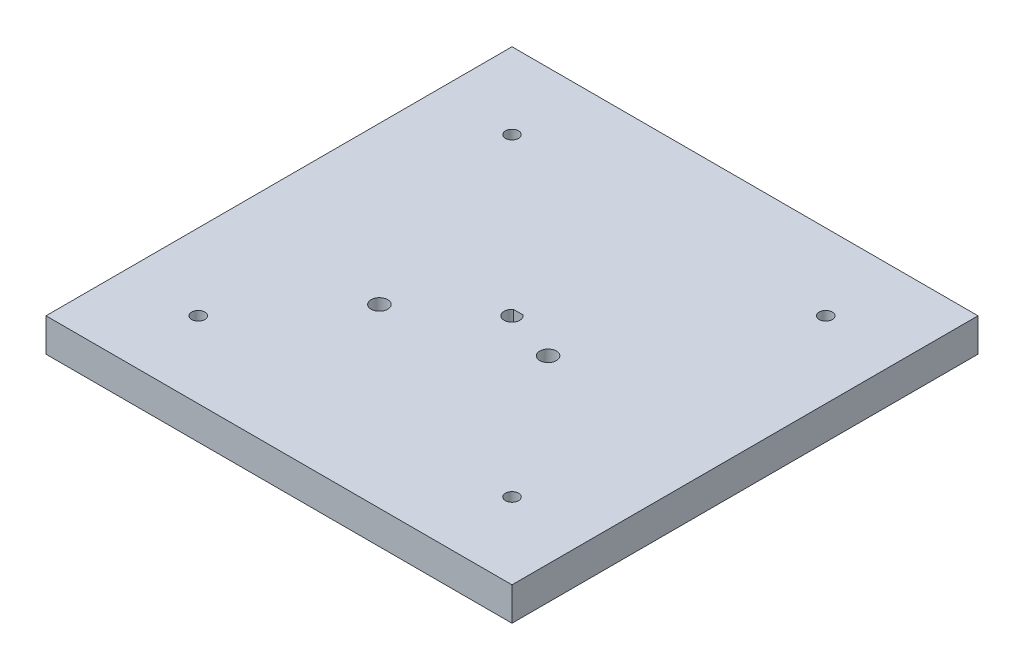
ISO-10303-21;
HEADER;
FILE_DESCRIPTION(('STEP AP214'),'2;1');
FILE_NAME('part.step','',(''),(''),'','','');
FILE_SCHEMA(('AUTOMOTIVE_DESIGN { 1 0 10303 214 1 1 1 1 }'));
ENDSEC;
DATA;
#1=APPLICATION_CONTEXT('core data for automotive mechanical design processes');
#2=APPLICATION_PROTOCOL_DEFINITION('international standard','automotive_design',2000,#1);
#3=PRODUCT_CONTEXT('',#1,'mechanical');
#4=PRODUCT('Part','Part','',(#3));
#5=PRODUCT_RELATED_PRODUCT_CATEGORY('part','',(#4));
#6=PRODUCT_DEFINITION_FORMATION('','',#4);
#7=PRODUCT_DEFINITION_CONTEXT('part definition',#1,'design');
#8=PRODUCT_DEFINITION('design','',#6,#7);
#9=PRODUCT_DEFINITION_SHAPE('','',#8);
#10=(LENGTH_UNIT() NAMED_UNIT(*) SI_UNIT(.MILLI.,.METRE.));
#11=(NAMED_UNIT(*) PLANE_ANGLE_UNIT() SI_UNIT($,.RADIAN.));
#12=(NAMED_UNIT(*) SI_UNIT($,.STERADIAN.) SOLID_ANGLE_UNIT());
#13=UNCERTAINTY_MEASURE_WITH_UNIT(LENGTH_MEASURE(1.E-05),#10,'distance_accuracy_value','');
#14=(GEOMETRIC_REPRESENTATION_CONTEXT(3) GLOBAL_UNCERTAINTY_ASSIGNED_CONTEXT((#13)) GLOBAL_UNIT_ASSIGNED_CONTEXT((#10,
#11,#12)) REPRESENTATION_CONTEXT('',''));
#15=CARTESIAN_POINT('',(0.,0.,0.));
#16=DIRECTION('',(0.,0.,1.));
#17=DIRECTION('',(1.,0.,0.));
#18=AXIS2_PLACEMENT_3D('',#15,#16,#17);
#19=CARTESIAN_POINT('',(0.,6.35,0.));
#20=DIRECTION('',(0.,-1.,0.));
#21=DIRECTION('',(0.,0.,-1.));
#22=AXIS2_PLACEMENT_3D('',#19,#20,#21);
#23=PLANE('',#22);
#24=CARTESIAN_POINT('',(20.1133422082485,6.35,6.34999999999994));
#25=DIRECTION('',(0.,1.,0.));
#26=DIRECTION('',(0.,0.,1.));
#27=AXIS2_PLACEMENT_3D('',#24,#25,#26);
#28=CIRCLE('',#27,3.17499999999999);
#29=CARTESIAN_POINT('',(20.1133422082485,6.35,9.52499999999993));
#30=VERTEX_POINT('',#29);
#31=EDGE_CURVE('E211',#30,#30,#28,.T.);
#32=ORIENTED_EDGE('',*,*,#31,.F.);
#33=EDGE_LOOP('',(#32));
#34=FACE_BOUND('',#33,.T.);
#35=CARTESIAN_POINT('',(-29.0356577917515,6.35,21.552614690566));
#36=DIRECTION('',(0.,1.,0.));
#37=DIRECTION('',(0.,0.,1.));
#38=AXIS2_PLACEMENT_3D('',#35,#36,#37);
#39=CIRCLE('',#38,3.175);
#40=CARTESIAN_POINT('',(-29.0356577917515,6.35,24.727614690566));
#41=VERTEX_POINT('',#40);
#42=EDGE_CURVE('E217',#41,#41,#39,.T.);
#43=ORIENTED_EDGE('',*,*,#42,.F.);
#44=EDGE_LOOP('',(#43));
#45=FACE_BOUND('',#44,.T.);
#46=CARTESIAN_POINT('',(-59.8565890274412,6.35,59.8565890274411));
#47=DIRECTION('',(0.,-1.,0.));
#48=DIRECTION('',(0.,0.,-1.));
#49=AXIS2_PLACEMENT_3D('',#46,#47,#48);
#50=CIRCLE('',#49,2.5);
#51=CARTESIAN_POINT('',(-59.8565890274412,6.35,57.3565890274412));
#52=VERTEX_POINT('',#51);
#53=EDGE_CURVE('E215',#52,#52,#50,.F.);
#54=ORIENTED_EDGE('',*,*,#53,.F.);
#55=EDGE_LOOP('',(#54));
#56=FACE_BOUND('',#55,.T.);
#57=CARTESIAN_POINT('',(59.856589027441,6.35,59.8565890274416));
#58=DIRECTION('',(0.,-1.,0.));
#59=DIRECTION('',(0.,0.,-1.));
#60=AXIS2_PLACEMENT_3D('',#57,#58,#59);
#61=CIRCLE('',#60,2.5);
#62=CARTESIAN_POINT('',(59.856589027441,6.35,57.3565890274416));
#63=VERTEX_POINT('',#62);
#64=EDGE_CURVE('E229',#63,#63,#61,.F.);
#65=ORIENTED_EDGE('',*,*,#64,.F.);
#66=EDGE_LOOP('',(#65));
#67=FACE_BOUND('',#66,.T.);
#68=CARTESIAN_POINT('',(59.8565890274413,6.35,-59.8565890274412));
#69=DIRECTION('',(0.,-1.,0.));
#70=DIRECTION('',(0.,0.,-1.));
#71=AXIS2_PLACEMENT_3D('',#68,#69,#70);
#72=CIRCLE('',#71,2.5);
#73=CARTESIAN_POINT('',(59.8565890274413,6.35,-62.3565890274412));
#74=VERTEX_POINT('',#73);
#75=EDGE_CURVE('E228',#74,#74,#72,.F.);
#76=ORIENTED_EDGE('',*,*,#75,.F.);
#77=EDGE_LOOP('',(#76));
#78=FACE_BOUND('',#77,.T.);
#79=CARTESIAN_POINT('',(-59.856589027441,6.35,-59.8565890274417));
#80=DIRECTION('',(0.,-1.,0.));
#81=DIRECTION('',(0.,0.,-1.));
#82=AXIS2_PLACEMENT_3D('',#79,#80,#81);
#83=CIRCLE('',#82,2.5);
#84=CARTESIAN_POINT('',(-59.856589027441,6.35,-62.3565890274417));
#85=VERTEX_POINT('',#84);
#86=EDGE_CURVE('E101',#85,#85,#83,.F.);
#87=ORIENTED_EDGE('',*,*,#86,.F.);
#88=EDGE_LOOP('',(#87));
#89=FACE_BOUND('',#88,.T.);
#90=DIRECTION('',(0.,0.,-1.));
#91=VECTOR('',#90,1.);
#92=CARTESIAN_POINT('',(88.9,6.35,88.9));
#93=LINE('',#92,#91);
#94=CARTESIAN_POINT('',(88.9,6.35,88.9));
#95=VERTEX_POINT('',#94);
#96=CARTESIAN_POINT('',(88.9,6.35,-88.9));
#97=VERTEX_POINT('',#96);
#98=EDGE_CURVE('E107',#95,#97,#93,.T.);
#99=ORIENTED_EDGE('',*,*,#98,.T.);
#100=DIRECTION('',(-1.,0.,0.));
#101=VECTOR('',#100,1.);
#102=CARTESIAN_POINT('',(-88.9,6.35,-88.9));
#103=LINE('',#102,#101);
#104=CARTESIAN_POINT('',(-88.9,6.35,-88.9));
#105=VERTEX_POINT('',#104);
#106=EDGE_CURVE('E110',#97,#105,#103,.T.);
#107=ORIENTED_EDGE('',*,*,#106,.T.);
#108=DIRECTION('',(0.,0.,1.));
#109=VECTOR('',#108,1.);
#110=CARTESIAN_POINT('',(-88.9,6.35,88.9));
#111=LINE('',#110,#109);
#112=CARTESIAN_POINT('',(-88.9,6.35,88.9));
#113=VERTEX_POINT('',#112);
#114=EDGE_CURVE('E113',#105,#113,#111,.T.);
#115=ORIENTED_EDGE('',*,*,#114,.T.);
#116=DIRECTION('',(1.,0.,0.));
#117=VECTOR('',#116,1.);
#118=CARTESIAN_POINT('',(-88.9,6.35,88.9));
#119=LINE('',#118,#117);
#120=EDGE_CURVE('E115',#113,#95,#119,.T.);
#121=ORIENTED_EDGE('',*,*,#120,.T.);
#122=EDGE_LOOP('',(#99,#107,#115,#121));
#123=FACE_BOUND('',#122,.T.);
#124=CARTESIAN_POINT('',(0.,6.35,0.));
#125=DIRECTION('',(0.,1.,0.));
#126=DIRECTION('',(0.,0.,1.));
#127=AXIS2_PLACEMENT_3D('',#124,#125,#126);
#128=CIRCLE('',#127,2.99999999999999);
#129=CARTESIAN_POINT('',(-1.79999999999999,6.35,-2.4));
#130=VERTEX_POINT('',#129);
#131=CARTESIAN_POINT('',(1.80000000000001,6.35,-2.4));
#132=VERTEX_POINT('',#131);
#133=EDGE_CURVE('E93',#130,#132,#128,.T.);
#134=ORIENTED_EDGE('',*,*,#133,.F.);
#135=DIRECTION('',(-1.,0.,0.));
#136=VECTOR('',#135,1.);
#137=CARTESIAN_POINT('',(-1.79999999999999,6.35,-2.4));
#138=LINE('',#137,#136);
#139=EDGE_CURVE('E87',#132,#130,#138,.T.);
#140=ORIENTED_EDGE('',*,*,#139,.F.);
#141=EDGE_LOOP('',(#134,#140));
#142=FACE_BOUND('',#141,.T.);
#143=ADVANCED_FACE('F35',(#34,#45,#56,#67,#78,#89,#123,#142),#23,.F.);
#144=CARTESIAN_POINT('',(0.,-6.35,0.));
#145=DIRECTION('',(0.,-1.,0.));
#146=DIRECTION('',(0.,0.,-1.));
#147=AXIS2_PLACEMENT_3D('',#144,#145,#146);
#148=PLANE('',#147);
#149=CARTESIAN_POINT('',(20.1133422082485,-6.35,6.34999999999994));
#150=DIRECTION('',(0.,-1.,0.));
#151=DIRECTION('',(0.,0.,-1.));
#152=AXIS2_PLACEMENT_3D('',#149,#150,#151);
#153=CIRCLE('',#152,3.17499999999999);
#154=CARTESIAN_POINT('',(20.1133422082485,-6.35,3.17499999999995));
#155=VERTEX_POINT('',#154);
#156=EDGE_CURVE('E209',#155,#155,#153,.F.);
#157=ORIENTED_EDGE('',*,*,#156,.T.);
#158=EDGE_LOOP('',(#157));
#159=FACE_BOUND('',#158,.T.);
#160=CARTESIAN_POINT('',(-29.0356577917515,-6.35,21.552614690566));
#161=DIRECTION('',(0.,-1.,0.));
#162=DIRECTION('',(0.,0.,-1.));
#163=AXIS2_PLACEMENT_3D('',#160,#161,#162);
#164=CIRCLE('',#163,3.175);
#165=CARTESIAN_POINT('',(-29.0356577917515,-6.35,18.377614690566));
#166=VERTEX_POINT('',#165);
#167=EDGE_CURVE('E222',#166,#166,#164,.F.);
#168=ORIENTED_EDGE('',*,*,#167,.T.);
#169=EDGE_LOOP('',(#168));
#170=FACE_BOUND('',#169,.T.);
#171=CARTESIAN_POINT('',(-59.8565890274412,-6.35,59.8565890274411));
#172=DIRECTION('',(0.,-1.,0.));
#173=DIRECTION('',(0.,0.,-1.));
#174=AXIS2_PLACEMENT_3D('',#171,#172,#173);
#175=CIRCLE('',#174,2.5);
#176=CARTESIAN_POINT('',(-59.8565890274412,-6.35,57.3565890274412));
#177=VERTEX_POINT('',#176);
#178=EDGE_CURVE('E212',#177,#177,#175,.T.);
#179=ORIENTED_EDGE('',*,*,#178,.F.);
#180=EDGE_LOOP('',(#179));
#181=FACE_BOUND('',#180,.T.);
#182=CARTESIAN_POINT('',(59.856589027441,-6.35,59.8565890274416));
#183=DIRECTION('',(0.,-1.,0.));
#184=DIRECTION('',(0.,0.,-1.));
#185=AXIS2_PLACEMENT_3D('',#182,#183,#184);
#186=CIRCLE('',#185,2.5);
#187=CARTESIAN_POINT('',(59.856589027441,-6.35,57.3565890274416));
#188=VERTEX_POINT('',#187);
#189=EDGE_CURVE('E233',#188,#188,#186,.T.);
#190=ORIENTED_EDGE('',*,*,#189,.F.);
#191=EDGE_LOOP('',(#190));
#192=FACE_BOUND('',#191,.T.);
#193=CARTESIAN_POINT('',(59.8565890274413,-6.35,-59.8565890274412));
#194=DIRECTION('',(0.,-1.,0.));
#195=DIRECTION('',(0.,0.,-1.));
#196=AXIS2_PLACEMENT_3D('',#193,#194,#195);
#197=CIRCLE('',#196,2.5);
#198=CARTESIAN_POINT('',(59.8565890274413,-6.35,-62.3565890274412));
#199=VERTEX_POINT('',#198);
#200=EDGE_CURVE('E225',#199,#199,#197,.T.);
#201=ORIENTED_EDGE('',*,*,#200,.F.);
#202=EDGE_LOOP('',(#201));
#203=FACE_BOUND('',#202,.T.);
#204=CARTESIAN_POINT('',(-59.856589027441,-6.35,-59.8565890274417));
#205=DIRECTION('',(0.,-1.,0.));
#206=DIRECTION('',(0.,0.,-1.));
#207=AXIS2_PLACEMENT_3D('',#204,#205,#206);
#208=CIRCLE('',#207,2.5);
#209=CARTESIAN_POINT('',(-59.856589027441,-6.35,-62.3565890274417));
#210=VERTEX_POINT('',#209);
#211=EDGE_CURVE('E232',#210,#210,#208,.T.);
#212=ORIENTED_EDGE('',*,*,#211,.F.);
#213=EDGE_LOOP('',(#212));
#214=FACE_BOUND('',#213,.T.);
#215=DIRECTION('',(0.,0.,-1.));
#216=VECTOR('',#215,1.);
#217=CARTESIAN_POINT('',(88.9,-6.35,88.9));
#218=LINE('',#217,#216);
#219=CARTESIAN_POINT('',(88.9,-6.35,88.9));
#220=VERTEX_POINT('',#219);
#221=CARTESIAN_POINT('',(88.9,-6.35,-88.9));
#222=VERTEX_POINT('',#221);
#223=EDGE_CURVE('E106',#220,#222,#218,.T.);
#224=ORIENTED_EDGE('',*,*,#223,.F.);
#225=DIRECTION('',(1.,0.,0.));
#226=VECTOR('',#225,1.);
#227=CARTESIAN_POINT('',(-88.9,-6.35,88.9));
#228=LINE('',#227,#226);
#229=CARTESIAN_POINT('',(-88.9,-6.35,88.9));
#230=VERTEX_POINT('',#229);
#231=EDGE_CURVE('E111',#230,#220,#228,.T.);
#232=ORIENTED_EDGE('',*,*,#231,.F.);
#233=DIRECTION('',(0.,0.,1.));
#234=VECTOR('',#233,1.);
#235=CARTESIAN_POINT('',(-88.9,-6.35,88.9));
#236=LINE('',#235,#234);
#237=CARTESIAN_POINT('',(-88.9,-6.35,-88.9));
#238=VERTEX_POINT('',#237);
#239=EDGE_CURVE('E122',#238,#230,#236,.T.);
#240=ORIENTED_EDGE('',*,*,#239,.F.);
#241=DIRECTION('',(-1.,0.,0.));
#242=VECTOR('',#241,1.);
#243=CARTESIAN_POINT('',(-88.9,-6.35,-88.9));
#244=LINE('',#243,#242);
#245=EDGE_CURVE('E120',#222,#238,#244,.T.);
#246=ORIENTED_EDGE('',*,*,#245,.F.);
#247=EDGE_LOOP('',(#224,#232,#240,#246));
#248=FACE_BOUND('',#247,.T.);
#249=DIRECTION('',(-1.,0.,0.));
#250=VECTOR('',#249,1.);
#251=CARTESIAN_POINT('',(-1.79999999999999,-6.35,-2.4));
#252=LINE('',#251,#250);
#253=CARTESIAN_POINT('',(1.80000000000001,-6.35,-2.4));
#254=VERTEX_POINT('',#253);
#255=CARTESIAN_POINT('',(-1.79999999999999,-6.35,-2.4));
#256=VERTEX_POINT('',#255);
#257=EDGE_CURVE('E97',#254,#256,#252,.T.);
#258=ORIENTED_EDGE('',*,*,#257,.T.);
#259=CARTESIAN_POINT('',(0.,-6.35,0.));
#260=DIRECTION('',(0.,1.,0.));
#261=DIRECTION('',(0.,0.,1.));
#262=AXIS2_PLACEMENT_3D('',#259,#260,#261);
#263=CIRCLE('',#262,2.99999999999999);
#264=EDGE_CURVE('E57',#256,#254,#263,.T.);
#265=ORIENTED_EDGE('',*,*,#264,.T.);
#266=EDGE_LOOP('',(#258,#265));
#267=FACE_BOUND('',#266,.T.);
#268=ADVANCED_FACE('F140',(#159,#170,#181,#192,#203,#214,#248,#267),#148,.T.);
#269=CARTESIAN_POINT('',(88.9,6.35,88.9));
#270=DIRECTION('',(-1.,0.,0.));
#271=DIRECTION('',(0.,0.,1.));
#272=AXIS2_PLACEMENT_3D('',#269,#270,#271);
#273=PLANE('',#272);
#274=ORIENTED_EDGE('',*,*,#223,.T.);
#275=DIRECTION('',(0.,-1.,0.));
#276=VECTOR('',#275,1.);
#277=CARTESIAN_POINT('',(88.9,6.35,-88.9));
#278=LINE('',#277,#276);
#279=EDGE_CURVE('E11',#97,#222,#278,.T.);
#280=ORIENTED_EDGE('',*,*,#279,.F.);
#281=ORIENTED_EDGE('',*,*,#98,.F.);
#282=DIRECTION('',(0.,-1.,0.));
#283=VECTOR('',#282,1.);
#284=CARTESIAN_POINT('',(88.9,6.35,88.9));
#285=LINE('',#284,#283);
#286=EDGE_CURVE('E117',#95,#220,#285,.T.);
#287=ORIENTED_EDGE('',*,*,#286,.T.);
#288=EDGE_LOOP('',(#274,#280,#281,#287));
#289=FACE_BOUND('',#288,.T.);
#290=ADVANCED_FACE('F37',(#289),#273,.F.);
#291=CARTESIAN_POINT('',(-88.9,6.35,-88.9));
#292=DIRECTION('',(0.,0.,1.));
#293=DIRECTION('',(1.,0.,0.));
#294=AXIS2_PLACEMENT_3D('',#291,#292,#293);
#295=PLANE('',#294);
#296=ORIENTED_EDGE('',*,*,#245,.T.);
#297=DIRECTION('',(0.,-1.,0.));
#298=VECTOR('',#297,1.);
#299=CARTESIAN_POINT('',(-88.9,6.35,-88.9));
#300=LINE('',#299,#298);
#301=EDGE_CURVE('E43',#105,#238,#300,.T.);
#302=ORIENTED_EDGE('',*,*,#301,.F.);
#303=ORIENTED_EDGE('',*,*,#106,.F.);
#304=ORIENTED_EDGE('',*,*,#279,.T.);
#305=EDGE_LOOP('',(#296,#302,#303,#304));
#306=FACE_BOUND('',#305,.T.);
#307=ADVANCED_FACE('F150',(#306),#295,.F.);
#308=CARTESIAN_POINT('',(-88.9,6.35,88.9));
#309=DIRECTION('',(1.,0.,0.));
#310=DIRECTION('',(0.,0.,-1.));
#311=AXIS2_PLACEMENT_3D('',#308,#309,#310);
#312=PLANE('',#311);
#313=ORIENTED_EDGE('',*,*,#239,.T.);
#314=DIRECTION('',(0.,-1.,0.));
#315=VECTOR('',#314,1.);
#316=CARTESIAN_POINT('',(-88.9,6.35,88.9));
#317=LINE('',#316,#315);
#318=EDGE_CURVE('E127',#113,#230,#317,.T.);
#319=ORIENTED_EDGE('',*,*,#318,.F.);
#320=ORIENTED_EDGE('',*,*,#114,.F.);
#321=ORIENTED_EDGE('',*,*,#301,.T.);
#322=EDGE_LOOP('',(#313,#319,#320,#321));
#323=FACE_BOUND('',#322,.T.);
#324=ADVANCED_FACE('F134',(#323),#312,.F.);
#325=CARTESIAN_POINT('',(-88.9,6.35,88.9));
#326=DIRECTION('',(0.,0.,-1.));
#327=DIRECTION('',(-1.,0.,0.));
#328=AXIS2_PLACEMENT_3D('',#325,#326,#327);
#329=PLANE('',#328);
#330=ORIENTED_EDGE('',*,*,#231,.T.);
#331=ORIENTED_EDGE('',*,*,#286,.F.);
#332=ORIENTED_EDGE('',*,*,#120,.F.);
#333=ORIENTED_EDGE('',*,*,#318,.T.);
#334=EDGE_LOOP('',(#330,#331,#332,#333));
#335=FACE_BOUND('',#334,.T.);
#336=ADVANCED_FACE('F144',(#335),#329,.F.);
#337=CARTESIAN_POINT('',(0.,6.35,0.));
#338=DIRECTION('',(0.,-1.,0.));
#339=DIRECTION('',(0.,0.,-1.));
#340=AXIS2_PLACEMENT_3D('',#337,#338,#339);
#341=CYLINDRICAL_SURFACE('',#340,2.99999999999999);
#342=ORIENTED_EDGE('',*,*,#264,.F.);
#343=DIRECTION('',(0.,-1.,0.));
#344=VECTOR('',#343,1.);
#345=CARTESIAN_POINT('',(-1.79999999999999,6.35,-2.4));
#346=LINE('',#345,#344);
#347=EDGE_CURVE('E89',#130,#256,#346,.T.);
#348=ORIENTED_EDGE('',*,*,#347,.F.);
#349=ORIENTED_EDGE('',*,*,#133,.T.);
#350=DIRECTION('',(0.,-1.,0.));
#351=VECTOR('',#350,1.);
#352=CARTESIAN_POINT('',(1.80000000000001,6.35,-2.4));
#353=LINE('',#352,#351);
#354=EDGE_CURVE('E50',#132,#254,#353,.T.);
#355=ORIENTED_EDGE('',*,*,#354,.T.);
#356=EDGE_LOOP('',(#342,#348,#349,#355));
#357=FACE_BOUND('',#356,.T.);
#358=ADVANCED_FACE('F95',(#357),#341,.F.);
#359=CARTESIAN_POINT('',(-1.79999999999999,6.35,-2.4));
#360=DIRECTION('',(0.,0.,1.));
#361=DIRECTION('',(1.,0.,0.));
#362=AXIS2_PLACEMENT_3D('',#359,#360,#361);
#363=PLANE('',#362);
#364=ORIENTED_EDGE('',*,*,#257,.F.);
#365=ORIENTED_EDGE('',*,*,#354,.F.);
#366=ORIENTED_EDGE('',*,*,#139,.T.);
#367=ORIENTED_EDGE('',*,*,#347,.T.);
#368=EDGE_LOOP('',(#364,#365,#366,#367));
#369=FACE_BOUND('',#368,.T.);
#370=ADVANCED_FACE('F88',(#369),#363,.T.);
#371=CARTESIAN_POINT('',(-59.856589027441,13.4210678118655,-59.8565890274417));
#372=DIRECTION('',(0.,-1.,0.));
#373=DIRECTION('',(0.,0.,-1.));
#374=AXIS2_PLACEMENT_3D('',#371,#372,#373);
#375=CYLINDRICAL_SURFACE('',#374,2.5);
#376=ORIENTED_EDGE('',*,*,#86,.T.);
#377=EDGE_LOOP('',(#376));
#378=FACE_BOUND('',#377,.T.);
#379=ORIENTED_EDGE('',*,*,#211,.T.);
#380=EDGE_LOOP('',(#379));
#381=FACE_BOUND('',#380,.T.);
#382=ADVANCED_FACE('F178',(#378,#381),#375,.F.);
#383=CARTESIAN_POINT('',(59.8565890274413,13.4210678118655,-59.8565890274412));
#384=DIRECTION('',(0.,-1.,0.));
#385=DIRECTION('',(0.,0.,-1.));
#386=AXIS2_PLACEMENT_3D('',#383,#384,#385);
#387=CYLINDRICAL_SURFACE('',#386,2.5);
#388=ORIENTED_EDGE('',*,*,#75,.T.);
#389=EDGE_LOOP('',(#388));
#390=FACE_BOUND('',#389,.T.);
#391=ORIENTED_EDGE('',*,*,#200,.T.);
#392=EDGE_LOOP('',(#391));
#393=FACE_BOUND('',#392,.T.);
#394=ADVANCED_FACE('F182',(#390,#393),#387,.F.);
#395=CARTESIAN_POINT('',(59.856589027441,13.4210678118655,59.8565890274416));
#396=DIRECTION('',(0.,-1.,0.));
#397=DIRECTION('',(0.,0.,-1.));
#398=AXIS2_PLACEMENT_3D('',#395,#396,#397);
#399=CYLINDRICAL_SURFACE('',#398,2.5);
#400=ORIENTED_EDGE('',*,*,#64,.T.);
#401=EDGE_LOOP('',(#400));
#402=FACE_BOUND('',#401,.T.);
#403=ORIENTED_EDGE('',*,*,#189,.T.);
#404=EDGE_LOOP('',(#403));
#405=FACE_BOUND('',#404,.T.);
#406=ADVANCED_FACE('F190',(#402,#405),#399,.F.);
#407=CARTESIAN_POINT('',(-59.8565890274412,13.4210678118655,59.8565890274411));
#408=DIRECTION('',(0.,-1.,0.));
#409=DIRECTION('',(0.,0.,-1.));
#410=AXIS2_PLACEMENT_3D('',#407,#408,#409);
#411=CYLINDRICAL_SURFACE('',#410,2.5);
#412=ORIENTED_EDGE('',*,*,#53,.T.);
#413=EDGE_LOOP('',(#412));
#414=FACE_BOUND('',#413,.T.);
#415=ORIENTED_EDGE('',*,*,#178,.T.);
#416=EDGE_LOOP('',(#415));
#417=FACE_BOUND('',#416,.T.);
#418=ADVANCED_FACE('F186',(#414,#417),#411,.F.);
#419=CARTESIAN_POINT('',(-29.0356577917515,-6.351,21.552614690566));
#420=DIRECTION('',(0.,1.,0.));
#421=DIRECTION('',(0.,0.,1.));
#422=AXIS2_PLACEMENT_3D('',#419,#420,#421);
#423=CYLINDRICAL_SURFACE('',#422,3.175);
#424=ORIENTED_EDGE('',*,*,#167,.F.);
#425=EDGE_LOOP('',(#424));
#426=FACE_BOUND('',#425,.T.);
#427=ORIENTED_EDGE('',*,*,#42,.T.);
#428=EDGE_LOOP('',(#427));
#429=FACE_BOUND('',#428,.T.);
#430=ADVANCED_FACE('F189',(#426,#429),#423,.F.);
#431=CARTESIAN_POINT('',(20.1133422082485,-6.351,6.34999999999994));
#432=DIRECTION('',(0.,1.,0.));
#433=DIRECTION('',(0.,0.,1.));
#434=AXIS2_PLACEMENT_3D('',#431,#432,#433);
#435=CYLINDRICAL_SURFACE('',#434,3.17499999999999);
#436=ORIENTED_EDGE('',*,*,#156,.F.);
#437=EDGE_LOOP('',(#436));
#438=FACE_BOUND('',#437,.T.);
#439=ORIENTED_EDGE('',*,*,#31,.T.);
#440=EDGE_LOOP('',(#439));
#441=FACE_BOUND('',#440,.T.);
#442=ADVANCED_FACE('F200',(#438,#441),#435,.F.);
#443=CLOSED_SHELL('',(#143,#268,#290,#307,#324,#336,#358,#370,#382,#394,#406,#418,#430,#442));
#444=MANIFOLD_SOLID_BREP('B2',#443);
#445=ADVANCED_BREP_SHAPE_REPRESENTATION('',(#18,#444),#14);
#446=SHAPE_DEFINITION_REPRESENTATION(#9,#445);
ENDSEC;
END-ISO-10303-21;
